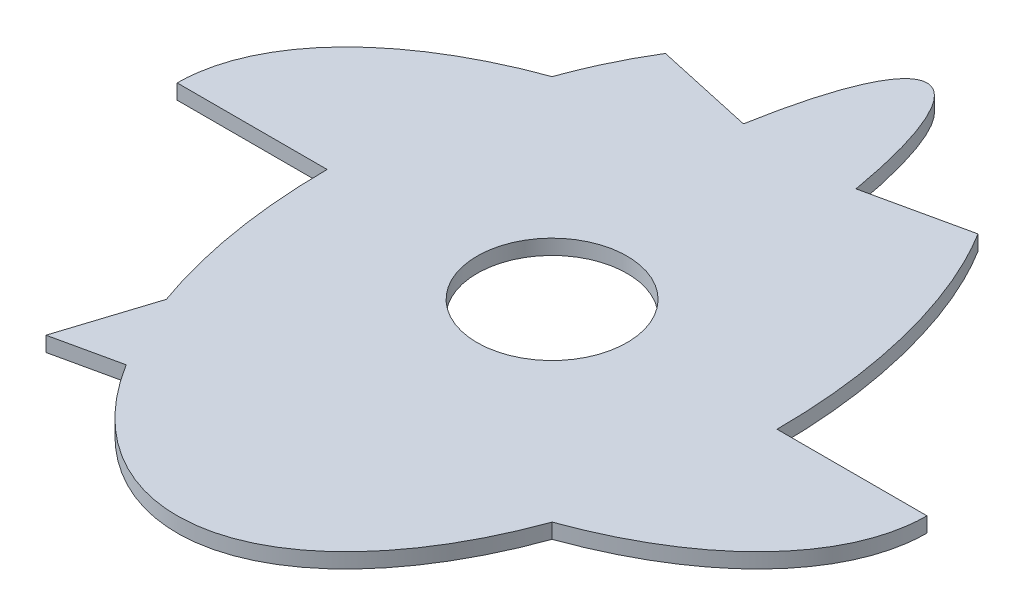
ISO-10303-21;
HEADER;
FILE_DESCRIPTION(('STEP AP214'),'2;1');
FILE_NAME('part.step','',(''),(''),'','','');
FILE_SCHEMA(('AUTOMOTIVE_DESIGN { 1 0 10303 214 1 1 1 1 }'));
ENDSEC;
DATA;
#1=APPLICATION_CONTEXT('core data for automotive mechanical design processes');
#2=APPLICATION_PROTOCOL_DEFINITION('international standard','automotive_design',2000,#1);
#3=PRODUCT_CONTEXT('',#1,'mechanical');
#4=PRODUCT('Part','Part','',(#3));
#5=PRODUCT_RELATED_PRODUCT_CATEGORY('part','',(#4));
#6=PRODUCT_DEFINITION_FORMATION('','',#4);
#7=PRODUCT_DEFINITION_CONTEXT('part definition',#1,'design');
#8=PRODUCT_DEFINITION('design','',#6,#7);
#9=PRODUCT_DEFINITION_SHAPE('','',#8);
#10=(LENGTH_UNIT() NAMED_UNIT(*) SI_UNIT(.MILLI.,.METRE.));
#11=(NAMED_UNIT(*) PLANE_ANGLE_UNIT() SI_UNIT($,.RADIAN.));
#12=(NAMED_UNIT(*) SI_UNIT($,.STERADIAN.) SOLID_ANGLE_UNIT());
#13=UNCERTAINTY_MEASURE_WITH_UNIT(LENGTH_MEASURE(1.E-05),#10,'distance_accuracy_value','');
#14=(GEOMETRIC_REPRESENTATION_CONTEXT(3) GLOBAL_UNCERTAINTY_ASSIGNED_CONTEXT((#13)) GLOBAL_UNIT_ASSIGNED_CONTEXT((#10,
#11,#12)) REPRESENTATION_CONTEXT('',''));
#15=CARTESIAN_POINT('',(0.,0.,0.));
#16=DIRECTION('',(0.,0.,1.));
#17=DIRECTION('',(1.,0.,0.));
#18=AXIS2_PLACEMENT_3D('',#15,#16,#17);
#19=CARTESIAN_POINT('',(6.57913665277068,2.,29.9329249695814));
#20=DIRECTION('',(0.214671716521423,0.,0.976686261870078));
#21=DIRECTION('',(0.976686261870078,0.,-0.214671716521423));
#22=AXIS2_PLACEMENT_3D('',#19,#20,#21);
#23=PLANE('',#22);
#24=DIRECTION('',(-0.976686261870078,0.,0.214671716521423));
#25=VECTOR('',#24,1.);
#26=CARTESIAN_POINT('',(6.57913665277068,0.,29.9329249695814));
#27=LINE('',#26,#25);
#28=CARTESIAN_POINT('',(-20.8438524144672,0.,35.9603877946859));
#29=VERTEX_POINT('',#28);
#30=CARTESIAN_POINT('',(-29.6078262731896,0.,37.8866740395631));
#31=VERTEX_POINT('',#30);
#32=EDGE_CURVE('E233',#29,#31,#27,.T.);
#33=ORIENTED_EDGE('',*,*,#32,.F.);
#34=DIRECTION('',(0.,-1.,0.));
#35=VECTOR('',#34,1.);
#36=CARTESIAN_POINT('',(-20.8438524144672,2.,35.9603877946859));
#37=LINE('',#36,#35);
#38=CARTESIAN_POINT('',(-20.8438524144672,2.,35.9603877946859));
#39=VERTEX_POINT('',#38);
#40=EDGE_CURVE('E11',#39,#29,#37,.T.);
#41=ORIENTED_EDGE('',*,*,#40,.F.);
#42=DIRECTION('',(-0.976686261870078,0.,0.214671716521423));
#43=VECTOR('',#42,1.);
#44=CARTESIAN_POINT('',(6.57913665277068,2.,29.9329249695814));
#45=LINE('',#44,#43);
#46=CARTESIAN_POINT('',(-29.6078262731896,2.,37.8866740395631));
#47=VERTEX_POINT('',#46);
#48=EDGE_CURVE('E271',#39,#47,#45,.T.);
#49=ORIENTED_EDGE('',*,*,#48,.T.);
#50=DIRECTION('',(0.,-1.,0.));
#51=VECTOR('',#50,1.);
#52=CARTESIAN_POINT('',(-29.6078262731896,2.,37.8866740395631));
#53=LINE('',#52,#51);
#54=EDGE_CURVE('E51',#47,#31,#53,.T.);
#55=ORIENTED_EDGE('',*,*,#54,.T.);
#56=EDGE_LOOP('',(#33,#41,#49,#55));
#57=FACE_BOUND('',#56,.T.);
#58=ADVANCED_FACE('F35',(#57),#23,.T.);
#59=CARTESIAN_POINT('',(0.,2.,0.));
#60=DIRECTION('',(0.,1.,0.));
#61=DIRECTION('',(0.,0.,1.));
#62=AXIS2_PLACEMENT_3D('',#59,#60,#61);
#63=ELLIPSE('',#62,50.,30.);
#64=DIRECTION('',(0.,-1.,0.));
#65=VECTOR('',#64,1.);
#66=SURFACE_OF_LINEAR_EXTRUSION('',#63,#65);
#67=CARTESIAN_POINT('',(0.,0.,0.));
#68=DIRECTION('',(0.,1.,0.));
#69=DIRECTION('',(0.,0.,1.));
#70=AXIS2_PLACEMENT_3D('',#67,#68,#69);
#71=ELLIPSE('',#70,50.,30.);
#72=CARTESIAN_POINT('',(25.7247877713763,0.,25.7247877713763));
#73=VERTEX_POINT('',#72);
#74=EDGE_CURVE('E227',#29,#73,#71,.T.);
#75=ORIENTED_EDGE('',*,*,#74,.T.);
#76=DIRECTION('',(0.,-1.,0.));
#77=VECTOR('',#76,1.);
#78=CARTESIAN_POINT('',(25.7247877713763,2.,25.7247877713763));
#79=LINE('',#78,#77);
#80=CARTESIAN_POINT('',(25.7247877713763,2.,25.7247877713763));
#81=VERTEX_POINT('',#80);
#82=EDGE_CURVE('E43',#81,#73,#79,.T.);
#83=ORIENTED_EDGE('',*,*,#82,.F.);
#84=EDGE_CURVE('E213',#39,#81,#63,.T.);
#85=ORIENTED_EDGE('',*,*,#84,.F.);
#86=ORIENTED_EDGE('',*,*,#40,.T.);
#87=EDGE_LOOP('',(#75,#83,#85,#86));
#88=FACE_BOUND('',#87,.T.);
#89=ADVANCED_FACE('F218',(#88),#66,.F.);
#90=CARTESIAN_POINT('',(0.,2.,0.));
#91=DIRECTION('',(0.,1.,0.));
#92=DIRECTION('',(1.,0.,0.));
#93=AXIS2_PLACEMENT_3D('',#90,#91,#92);
#94=ELLIPSE('',#93,50.,30.);
#95=DIRECTION('',(0.,-1.,0.));
#96=VECTOR('',#95,1.);
#97=SURFACE_OF_LINEAR_EXTRUSION('',#94,#96);
#98=CARTESIAN_POINT('',(0.,0.,0.));
#99=DIRECTION('',(0.,1.,0.));
#100=DIRECTION('',(1.,0.,0.));
#101=AXIS2_PLACEMENT_3D('',#98,#99,#100);
#102=ELLIPSE('',#101,50.,30.);
#103=CARTESIAN_POINT('',(50.,0.,0.));
#104=VERTEX_POINT('',#103);
#105=EDGE_CURVE('E232',#73,#104,#102,.T.);
#106=ORIENTED_EDGE('',*,*,#105,.T.);
#107=DIRECTION('',(0.,-1.,0.));
#108=VECTOR('',#107,1.);
#109=CARTESIAN_POINT('',(50.,2.,0.));
#110=LINE('',#109,#108);
#111=CARTESIAN_POINT('',(50.,2.,0.));
#112=VERTEX_POINT('',#111);
#113=EDGE_CURVE('E238',#112,#104,#110,.T.);
#114=ORIENTED_EDGE('',*,*,#113,.F.);
#115=EDGE_CURVE('E210',#81,#112,#94,.T.);
#116=ORIENTED_EDGE('',*,*,#115,.F.);
#117=ORIENTED_EDGE('',*,*,#82,.T.);
#118=EDGE_LOOP('',(#106,#114,#116,#117));
#119=FACE_BOUND('',#118,.T.);
#120=ADVANCED_FACE('F216',(#119),#97,.F.);
#121=CARTESIAN_POINT('',(0.,2.,0.));
#122=DIRECTION('',(0.,0.,-1.));
#123=DIRECTION('',(-1.,0.,0.));
#124=AXIS2_PLACEMENT_3D('',#121,#122,#123);
#125=PLANE('',#124);
#126=DIRECTION('',(1.,0.,0.));
#127=VECTOR('',#126,1.);
#128=CARTESIAN_POINT('',(0.,0.,0.));
#129=LINE('',#128,#127);
#130=CARTESIAN_POINT('',(30.,0.,0.));
#131=VERTEX_POINT('',#130);
#132=EDGE_CURVE('E243',#131,#104,#129,.T.);
#133=ORIENTED_EDGE('',*,*,#132,.F.);
#134=DIRECTION('',(0.,-1.,0.));
#135=VECTOR('',#134,1.);
#136=CARTESIAN_POINT('',(30.,2.,0.));
#137=LINE('',#136,#135);
#138=CARTESIAN_POINT('',(30.,2.,0.));
#139=VERTEX_POINT('',#138);
#140=EDGE_CURVE('E288',#139,#131,#137,.T.);
#141=ORIENTED_EDGE('',*,*,#140,.F.);
#142=DIRECTION('',(1.,0.,0.));
#143=VECTOR('',#142,1.);
#144=CARTESIAN_POINT('',(0.,2.,0.));
#145=LINE('',#144,#143);
#146=EDGE_CURVE('E207',#139,#112,#145,.T.);
#147=ORIENTED_EDGE('',*,*,#146,.T.);
#148=ORIENTED_EDGE('',*,*,#113,.T.);
#149=EDGE_LOOP('',(#133,#141,#147,#148));
#150=FACE_BOUND('',#149,.T.);
#151=ADVANCED_FACE('F201',(#150),#125,.T.);
#152=CARTESIAN_POINT('',(0.,2.,0.));
#153=DIRECTION('',(0.,1.,0.));
#154=DIRECTION('',(0.,0.,1.));
#155=AXIS2_PLACEMENT_3D('',#152,#153,#154);
#156=ELLIPSE('',#155,50.,30.);
#157=DIRECTION('',(0.,-1.,0.));
#158=VECTOR('',#157,1.);
#159=SURFACE_OF_LINEAR_EXTRUSION('',#156,#158);
#160=CARTESIAN_POINT('',(0.,0.,0.));
#161=DIRECTION('',(0.,1.,0.));
#162=DIRECTION('',(0.,0.,1.));
#163=AXIS2_PLACEMENT_3D('',#160,#161,#162);
#164=ELLIPSE('',#163,50.,30.);
#165=CARTESIAN_POINT('',(20.8438524144672,0.,-35.9603877946859));
#166=VERTEX_POINT('',#165);
#167=EDGE_CURVE('E245',#131,#166,#164,.T.);
#168=ORIENTED_EDGE('',*,*,#167,.T.);
#169=DIRECTION('',(0.,-1.,0.));
#170=VECTOR('',#169,1.);
#171=CARTESIAN_POINT('',(20.8438524144672,2.,-35.9603877946859));
#172=LINE('',#171,#170);
#173=CARTESIAN_POINT('',(20.8438524144672,2.,-35.9603877946859));
#174=VERTEX_POINT('',#173);
#175=EDGE_CURVE('E286',#174,#166,#172,.T.);
#176=ORIENTED_EDGE('',*,*,#175,.F.);
#177=EDGE_CURVE('E204',#139,#174,#156,.T.);
#178=ORIENTED_EDGE('',*,*,#177,.F.);
#179=ORIENTED_EDGE('',*,*,#140,.T.);
#180=EDGE_LOOP('',(#168,#176,#178,#179));
#181=FACE_BOUND('',#180,.T.);
#182=ADVANCED_FACE('F197',(#181),#159,.F.);
#183=CARTESIAN_POINT('',(-6.57913665277068,2.,-29.9329249695814));
#184=DIRECTION('',(-0.214671716521423,0.,-0.976686261870078));
#185=DIRECTION('',(-0.976686261870078,0.,0.214671716521423));
#186=AXIS2_PLACEMENT_3D('',#183,#184,#185);
#187=PLANE('',#186);
#188=DIRECTION('',(0.976686261870078,0.,-0.214671716521423));
#189=VECTOR('',#188,1.);
#190=CARTESIAN_POINT('',(-6.57913665277068,0.,-29.9329249695814));
#191=LINE('',#190,#189);
#192=CARTESIAN_POINT('',(7.50753568355826,0.,-33.0291189558923));
#193=VERTEX_POINT('',#192);
#194=EDGE_CURVE('E251',#193,#166,#191,.T.);
#195=ORIENTED_EDGE('',*,*,#194,.F.);
#196=DIRECTION('',(0.,-1.,0.));
#197=VECTOR('',#196,1.);
#198=CARTESIAN_POINT('',(7.50753568355826,2.,-33.0291189558923));
#199=LINE('',#198,#197);
#200=CARTESIAN_POINT('',(7.50753568355826,2.,-33.0291189558923));
#201=VERTEX_POINT('',#200);
#202=EDGE_CURVE('E284',#201,#193,#199,.T.);
#203=ORIENTED_EDGE('',*,*,#202,.F.);
#204=DIRECTION('',(0.976686261870078,0.,-0.214671716521423));
#205=VECTOR('',#204,1.);
#206=CARTESIAN_POINT('',(-6.57913665277068,2.,-29.9329249695814));
#207=LINE('',#206,#205);
#208=EDGE_CURVE('E186',#201,#174,#207,.T.);
#209=ORIENTED_EDGE('',*,*,#208,.T.);
#210=ORIENTED_EDGE('',*,*,#175,.T.);
#211=EDGE_LOOP('',(#195,#203,#209,#210));
#212=FACE_BOUND('',#211,.T.);
#213=ADVANCED_FACE('F193',(#212),#187,.T.);
#214=CARTESIAN_POINT('',(0.,2.,0.));
#215=DIRECTION('',(0.,1.,0.));
#216=DIRECTION('',(0.,0.,-1.));
#217=AXIS2_PLACEMENT_3D('',#214,#215,#216);
#218=ELLIPSE('',#217,50.,10.);
#219=DIRECTION('',(0.,-1.,0.));
#220=VECTOR('',#219,1.);
#221=SURFACE_OF_LINEAR_EXTRUSION('',#218,#220);
#222=CARTESIAN_POINT('',(0.,0.,0.));
#223=DIRECTION('',(0.,1.,0.));
#224=DIRECTION('',(0.,0.,-1.));
#225=AXIS2_PLACEMENT_3D('',#222,#223,#224);
#226=ELLIPSE('',#225,50.,10.);
#227=CARTESIAN_POINT('',(-7.50753568355826,0.,-33.0291189558923));
#228=VERTEX_POINT('',#227);
#229=EDGE_CURVE('E254',#193,#228,#226,.T.);
#230=ORIENTED_EDGE('',*,*,#229,.T.);
#231=DIRECTION('',(0.,-1.,0.));
#232=VECTOR('',#231,1.);
#233=CARTESIAN_POINT('',(-7.50753568355826,2.,-33.0291189558923));
#234=LINE('',#233,#232);
#235=CARTESIAN_POINT('',(-7.50753568355826,2.,-33.0291189558923));
#236=VERTEX_POINT('',#235);
#237=EDGE_CURVE('E281',#236,#228,#234,.T.);
#238=ORIENTED_EDGE('',*,*,#237,.F.);
#239=EDGE_CURVE('E183',#201,#236,#218,.T.);
#240=ORIENTED_EDGE('',*,*,#239,.F.);
#241=ORIENTED_EDGE('',*,*,#202,.T.);
#242=EDGE_LOOP('',(#230,#238,#240,#241));
#243=FACE_BOUND('',#242,.T.);
#244=ADVANCED_FACE('F189',(#243),#221,.F.);
#245=CARTESIAN_POINT('',(6.57913665277068,2.,-29.9329249695814));
#246=DIRECTION('',(-0.214671716521423,0.,0.976686261870078));
#247=DIRECTION('',(0.976686261870078,0.,0.214671716521423));
#248=AXIS2_PLACEMENT_3D('',#245,#246,#247);
#249=PLANE('',#248);
#250=DIRECTION('',(-0.976686261870078,0.,-0.214671716521423));
#251=VECTOR('',#250,1.);
#252=CARTESIAN_POINT('',(6.57913665277068,0.,-29.9329249695814));
#253=LINE('',#252,#251);
#254=CARTESIAN_POINT('',(-20.8438524144672,0.,-35.9603877946859));
#255=VERTEX_POINT('',#254);
#256=EDGE_CURVE('E256',#228,#255,#253,.T.);
#257=ORIENTED_EDGE('',*,*,#256,.T.);
#258=DIRECTION('',(0.,-1.,0.));
#259=VECTOR('',#258,1.);
#260=CARTESIAN_POINT('',(-20.8438524144672,2.,-35.9603877946859));
#261=LINE('',#260,#259);
#262=CARTESIAN_POINT('',(-20.8438524144672,2.,-35.9603877946859));
#263=VERTEX_POINT('',#262);
#264=EDGE_CURVE('E278',#263,#255,#261,.T.);
#265=ORIENTED_EDGE('',*,*,#264,.F.);
#266=DIRECTION('',(-0.976686261870078,0.,-0.214671716521423));
#267=VECTOR('',#266,1.);
#268=CARTESIAN_POINT('',(6.57913665277068,2.,-29.9329249695814));
#269=LINE('',#268,#267);
#270=EDGE_CURVE('E181',#236,#263,#269,.T.);
#271=ORIENTED_EDGE('',*,*,#270,.F.);
#272=ORIENTED_EDGE('',*,*,#237,.T.);
#273=EDGE_LOOP('',(#257,#265,#271,#272));
#274=FACE_BOUND('',#273,.T.);
#275=ADVANCED_FACE('F192',(#274),#249,.F.);
#276=CARTESIAN_POINT('',(0.,2.,0.));
#277=DIRECTION('',(0.,1.,0.));
#278=DIRECTION('',(0.,0.,1.));
#279=AXIS2_PLACEMENT_3D('',#276,#277,#278);
#280=ELLIPSE('',#279,50.,30.);
#281=DIRECTION('',(0.,-1.,0.));
#282=VECTOR('',#281,1.);
#283=SURFACE_OF_LINEAR_EXTRUSION('',#280,#282);
#284=CARTESIAN_POINT('',(0.,0.,0.));
#285=DIRECTION('',(0.,1.,0.));
#286=DIRECTION('',(0.,0.,1.));
#287=AXIS2_PLACEMENT_3D('',#284,#285,#286);
#288=ELLIPSE('',#287,50.,30.);
#289=CARTESIAN_POINT('',(-25.7247877713763,0.,-25.7247877713763));
#290=VERTEX_POINT('',#289);
#291=EDGE_CURVE('E258',#255,#290,#288,.T.);
#292=ORIENTED_EDGE('',*,*,#291,.T.);
#293=DIRECTION('',(0.,-1.,0.));
#294=VECTOR('',#293,1.);
#295=CARTESIAN_POINT('',(-25.7247877713763,2.,-25.7247877713763));
#296=LINE('',#295,#294);
#297=CARTESIAN_POINT('',(-25.7247877713763,2.,-25.7247877713763));
#298=VERTEX_POINT('',#297);
#299=EDGE_CURVE('E275',#298,#290,#296,.T.);
#300=ORIENTED_EDGE('',*,*,#299,.F.);
#301=EDGE_CURVE('E178',#263,#298,#280,.T.);
#302=ORIENTED_EDGE('',*,*,#301,.F.);
#303=ORIENTED_EDGE('',*,*,#264,.T.);
#304=EDGE_LOOP('',(#292,#300,#302,#303));
#305=FACE_BOUND('',#304,.T.);
#306=ADVANCED_FACE('F173',(#305),#283,.F.);
#307=CARTESIAN_POINT('',(0.,2.,0.));
#308=DIRECTION('',(0.,1.,0.));
#309=DIRECTION('',(1.,0.,0.));
#310=AXIS2_PLACEMENT_3D('',#307,#308,#309);
#311=ELLIPSE('',#310,50.,30.);
#312=DIRECTION('',(0.,-1.,0.));
#313=VECTOR('',#312,1.);
#314=SURFACE_OF_LINEAR_EXTRUSION('',#311,#313);
#315=CARTESIAN_POINT('',(0.,0.,0.));
#316=DIRECTION('',(0.,1.,0.));
#317=DIRECTION('',(1.,0.,0.));
#318=AXIS2_PLACEMENT_3D('',#315,#316,#317);
#319=ELLIPSE('',#318,50.,30.);
#320=CARTESIAN_POINT('',(-50.,0.,0.));
#321=VERTEX_POINT('',#320);
#322=EDGE_CURVE('E260',#290,#321,#319,.T.);
#323=ORIENTED_EDGE('',*,*,#322,.T.);
#324=DIRECTION('',(0.,-1.,0.));
#325=VECTOR('',#324,1.);
#326=CARTESIAN_POINT('',(-50.,2.,0.));
#327=LINE('',#326,#325);
#328=CARTESIAN_POINT('',(-50.,2.,0.));
#329=VERTEX_POINT('',#328);
#330=EDGE_CURVE('E152',#329,#321,#327,.T.);
#331=ORIENTED_EDGE('',*,*,#330,.F.);
#332=EDGE_CURVE('E140',#298,#329,#311,.T.);
#333=ORIENTED_EDGE('',*,*,#332,.F.);
#334=ORIENTED_EDGE('',*,*,#299,.T.);
#335=EDGE_LOOP('',(#323,#331,#333,#334));
#336=FACE_BOUND('',#335,.T.);
#337=ADVANCED_FACE('F170',(#336),#314,.F.);
#338=CARTESIAN_POINT('',(0.,2.,0.));
#339=DIRECTION('',(0.,0.,-1.));
#340=DIRECTION('',(-1.,0.,0.));
#341=AXIS2_PLACEMENT_3D('',#338,#339,#340);
#342=PLANE('',#341);
#343=DIRECTION('',(1.,0.,0.));
#344=VECTOR('',#343,1.);
#345=CARTESIAN_POINT('',(0.,0.,0.));
#346=LINE('',#345,#344);
#347=CARTESIAN_POINT('',(-30.,0.,0.));
#348=VERTEX_POINT('',#347);
#349=EDGE_CURVE('E149',#321,#348,#346,.T.);
#350=ORIENTED_EDGE('',*,*,#349,.T.);
#351=DIRECTION('',(0.,-1.,0.));
#352=VECTOR('',#351,1.);
#353=CARTESIAN_POINT('',(-30.,2.,0.));
#354=LINE('',#353,#352);
#355=CARTESIAN_POINT('',(-30.,2.,0.));
#356=VERTEX_POINT('',#355);
#357=EDGE_CURVE('E146',#356,#348,#354,.T.);
#358=ORIENTED_EDGE('',*,*,#357,.F.);
#359=DIRECTION('',(1.,0.,0.));
#360=VECTOR('',#359,1.);
#361=CARTESIAN_POINT('',(0.,2.,0.));
#362=LINE('',#361,#360);
#363=EDGE_CURVE('E131',#329,#356,#362,.T.);
#364=ORIENTED_EDGE('',*,*,#363,.F.);
#365=ORIENTED_EDGE('',*,*,#330,.T.);
#366=EDGE_LOOP('',(#350,#358,#364,#365));
#367=FACE_BOUND('',#366,.T.);
#368=ADVANCED_FACE('F147',(#367),#342,.F.);
#369=CARTESIAN_POINT('',(0.,2.,0.));
#370=DIRECTION('',(0.,1.,0.));
#371=DIRECTION('',(0.,0.,1.));
#372=AXIS2_PLACEMENT_3D('',#369,#370,#371);
#373=ELLIPSE('',#372,50.,30.);
#374=DIRECTION('',(0.,-1.,0.));
#375=VECTOR('',#374,1.);
#376=SURFACE_OF_LINEAR_EXTRUSION('',#373,#375);
#377=CARTESIAN_POINT('',(0.,0.,0.));
#378=DIRECTION('',(0.,1.,0.));
#379=DIRECTION('',(0.,0.,1.));
#380=AXIS2_PLACEMENT_3D('',#377,#378,#379);
#381=ELLIPSE('',#380,50.,30.);
#382=CARTESIAN_POINT('',(-25.7247877713763,0.,25.7247877713763));
#383=VERTEX_POINT('',#382);
#384=EDGE_CURVE('E263',#348,#383,#381,.T.);
#385=ORIENTED_EDGE('',*,*,#384,.T.);
#386=DIRECTION('',(0.,-1.,0.));
#387=VECTOR('',#386,1.);
#388=CARTESIAN_POINT('',(-25.7247877713763,2.,25.7247877713763));
#389=LINE('',#388,#387);
#390=CARTESIAN_POINT('',(-25.7247877713763,2.,25.7247877713763));
#391=VERTEX_POINT('',#390);
#392=EDGE_CURVE('E92',#391,#383,#389,.T.);
#393=ORIENTED_EDGE('',*,*,#392,.F.);
#394=EDGE_CURVE('E138',#356,#391,#373,.T.);
#395=ORIENTED_EDGE('',*,*,#394,.F.);
#396=ORIENTED_EDGE('',*,*,#357,.T.);
#397=EDGE_LOOP('',(#385,#393,#395,#396));
#398=FACE_BOUND('',#397,.T.);
#399=ADVANCED_FACE('F154',(#398),#376,.F.);
#400=CARTESIAN_POINT('',(-15.8914343916397,2.,-5.07380600599683));
#401=DIRECTION('',(-0.952623234761932,0.,-0.304152877007126));
#402=DIRECTION('',(-0.304152877007126,0.,0.952623234761932));
#403=AXIS2_PLACEMENT_3D('',#400,#401,#402);
#404=PLANE('',#403);
#405=DIRECTION('',(0.304152877007126,0.,-0.952623234761932));
#406=VECTOR('',#405,1.);
#407=CARTESIAN_POINT('',(-15.8914343916397,0.,-5.07380600599683));
#408=LINE('',#407,#406);
#409=EDGE_CURVE('E265',#31,#383,#408,.T.);
#410=ORIENTED_EDGE('',*,*,#409,.F.);
#411=ORIENTED_EDGE('',*,*,#54,.F.);
#412=DIRECTION('',(0.304152877007126,0.,-0.952623234761932));
#413=VECTOR('',#412,1.);
#414=CARTESIAN_POINT('',(-15.8914343916397,2.,-5.07380600599683));
#415=LINE('',#414,#413);
#416=EDGE_CURVE('E155',#47,#391,#415,.T.);
#417=ORIENTED_EDGE('',*,*,#416,.T.);
#418=ORIENTED_EDGE('',*,*,#392,.T.);
#419=EDGE_LOOP('',(#410,#411,#417,#418));
#420=FACE_BOUND('',#419,.T.);
#421=ADVANCED_FACE('F166',(#420),#404,.T.);
#422=CARTESIAN_POINT('',(0.,2.,0.));
#423=DIRECTION('',(0.,-1.,0.));
#424=DIRECTION('',(0.,0.,-1.));
#425=AXIS2_PLACEMENT_3D('',#422,#423,#424);
#426=CYLINDRICAL_SURFACE('',#425,10.);
#427=CARTESIAN_POINT('',(0.,2.,0.));
#428=DIRECTION('',(0.,1.,0.));
#429=DIRECTION('',(0.,0.,1.));
#430=AXIS2_PLACEMENT_3D('',#427,#428,#429);
#431=CIRCLE('',#430,10.);
#432=CARTESIAN_POINT('',(0.,2.,10.));
#433=VERTEX_POINT('',#432);
#434=EDGE_CURVE('E157',#433,#433,#431,.T.);
#435=ORIENTED_EDGE('',*,*,#434,.T.);
#436=EDGE_LOOP('',(#435));
#437=FACE_BOUND('',#436,.T.);
#438=CARTESIAN_POINT('',(0.,0.,0.));
#439=DIRECTION('',(0.,1.,0.));
#440=DIRECTION('',(0.,0.,1.));
#441=AXIS2_PLACEMENT_3D('',#438,#439,#440);
#442=CIRCLE('',#441,10.);
#443=CARTESIAN_POINT('',(0.,0.,10.));
#444=VERTEX_POINT('',#443);
#445=EDGE_CURVE('E268',#444,#444,#442,.T.);
#446=ORIENTED_EDGE('',*,*,#445,.F.);
#447=EDGE_LOOP('',(#446));
#448=FACE_BOUND('',#447,.T.);
#449=ADVANCED_FACE('F296',(#437,#448),#426,.F.);
#450=CARTESIAN_POINT('',(0.,2.,0.));
#451=DIRECTION('',(0.,1.,0.));
#452=DIRECTION('',(0.,0.,1.));
#453=AXIS2_PLACEMENT_3D('',#450,#451,#452);
#454=PLANE('',#453);
#455=ORIENTED_EDGE('',*,*,#48,.F.);
#456=ORIENTED_EDGE('',*,*,#84,.T.);
#457=ORIENTED_EDGE('',*,*,#115,.T.);
#458=ORIENTED_EDGE('',*,*,#146,.F.);
#459=ORIENTED_EDGE('',*,*,#177,.T.);
#460=ORIENTED_EDGE('',*,*,#208,.F.);
#461=ORIENTED_EDGE('',*,*,#239,.T.);
#462=ORIENTED_EDGE('',*,*,#270,.T.);
#463=ORIENTED_EDGE('',*,*,#301,.T.);
#464=ORIENTED_EDGE('',*,*,#332,.T.);
#465=ORIENTED_EDGE('',*,*,#363,.T.);
#466=ORIENTED_EDGE('',*,*,#394,.T.);
#467=ORIENTED_EDGE('',*,*,#416,.F.);
#468=EDGE_LOOP('',(#455,#456,#457,#458,#459,#460,#461,#462,#463,#464,#465,#466,#467));
#469=FACE_BOUND('',#468,.T.);
#470=ORIENTED_EDGE('',*,*,#434,.F.);
#471=EDGE_LOOP('',(#470));
#472=FACE_BOUND('',#471,.T.);
#473=ADVANCED_FACE('F134',(#469,#472),#454,.T.);
#474=CARTESIAN_POINT('',(0.,0.,0.));
#475=DIRECTION('',(0.,1.,0.));
#476=DIRECTION('',(0.,0.,1.));
#477=AXIS2_PLACEMENT_3D('',#474,#475,#476);
#478=PLANE('',#477);
#479=ORIENTED_EDGE('',*,*,#32,.T.);
#480=ORIENTED_EDGE('',*,*,#409,.T.);
#481=ORIENTED_EDGE('',*,*,#384,.F.);
#482=ORIENTED_EDGE('',*,*,#349,.F.);
#483=ORIENTED_EDGE('',*,*,#322,.F.);
#484=ORIENTED_EDGE('',*,*,#291,.F.);
#485=ORIENTED_EDGE('',*,*,#256,.F.);
#486=ORIENTED_EDGE('',*,*,#229,.F.);
#487=ORIENTED_EDGE('',*,*,#194,.T.);
#488=ORIENTED_EDGE('',*,*,#167,.F.);
#489=ORIENTED_EDGE('',*,*,#132,.T.);
#490=ORIENTED_EDGE('',*,*,#105,.F.);
#491=ORIENTED_EDGE('',*,*,#74,.F.);
#492=EDGE_LOOP('',(#479,#480,#481,#482,#483,#484,#485,#486,#487,#488,#489,#490,#491));
#493=FACE_BOUND('',#492,.T.);
#494=ORIENTED_EDGE('',*,*,#445,.T.);
#495=EDGE_LOOP('',(#494));
#496=FACE_BOUND('',#495,.T.);
#497=ADVANCED_FACE('F239',(#493,#496),#478,.F.);
#498=CLOSED_SHELL('',(#58,#89,#120,#151,#182,#213,#244,#275,#306,#337,#368,#399,#421,#449,#473,#497));
#499=MANIFOLD_SOLID_BREP('B2',#498);
#500=ADVANCED_BREP_SHAPE_REPRESENTATION('',(#18,#499),#14);
#501=SHAPE_DEFINITION_REPRESENTATION(#9,#500);
ENDSEC;
END-ISO-10303-21;
